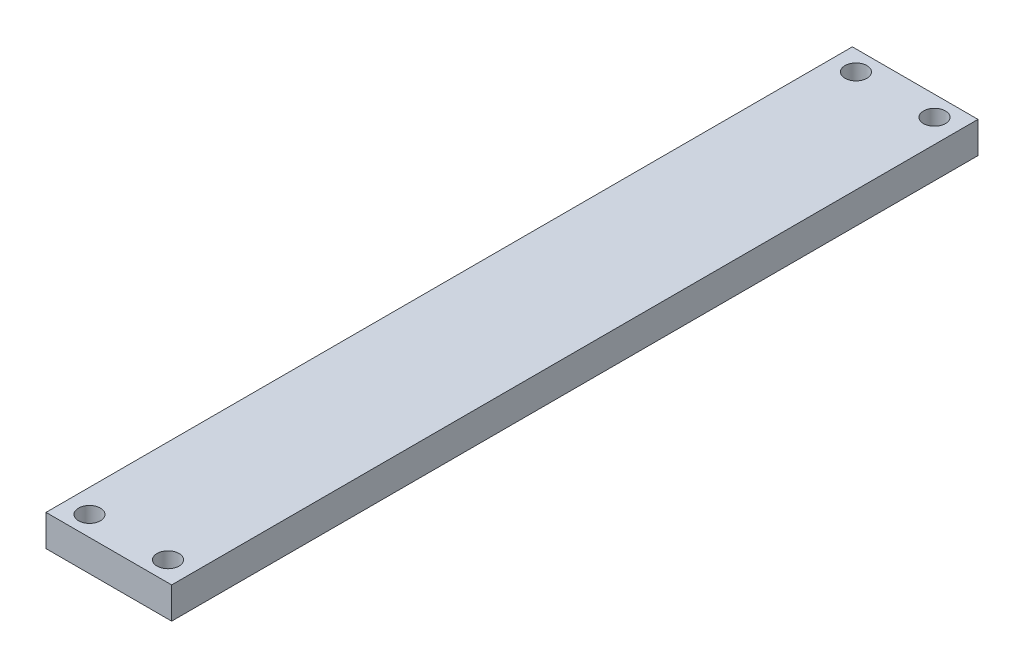
ISO-10303-21;
HEADER;
FILE_DESCRIPTION(('STEP AP214'),'2;1');
FILE_NAME('part.step','',(''),(''),'','','');
FILE_SCHEMA(('AUTOMOTIVE_DESIGN { 1 0 10303 214 1 1 1 1 }'));
ENDSEC;
DATA;
#1=APPLICATION_CONTEXT('core data for automotive mechanical design processes');
#2=APPLICATION_PROTOCOL_DEFINITION('international standard','automotive_design',2000,#1);
#3=PRODUCT_CONTEXT('',#1,'mechanical');
#4=PRODUCT('Part','Part','',(#3));
#5=PRODUCT_RELATED_PRODUCT_CATEGORY('part','',(#4));
#6=PRODUCT_DEFINITION_FORMATION('','',#4);
#7=PRODUCT_DEFINITION_CONTEXT('part definition',#1,'design');
#8=PRODUCT_DEFINITION('design','',#6,#7);
#9=PRODUCT_DEFINITION_SHAPE('','',#8);
#10=(LENGTH_UNIT() NAMED_UNIT(*) SI_UNIT(.MILLI.,.METRE.));
#11=(NAMED_UNIT(*) PLANE_ANGLE_UNIT() SI_UNIT($,.RADIAN.));
#12=(NAMED_UNIT(*) SI_UNIT($,.STERADIAN.) SOLID_ANGLE_UNIT());
#13=UNCERTAINTY_MEASURE_WITH_UNIT(LENGTH_MEASURE(1.E-05),#10,'distance_accuracy_value','');
#14=(GEOMETRIC_REPRESENTATION_CONTEXT(3) GLOBAL_UNCERTAINTY_ASSIGNED_CONTEXT((#13)) GLOBAL_UNIT_ASSIGNED_CONTEXT((#10,
#11,#12)) REPRESENTATION_CONTEXT('',''));
#15=CARTESIAN_POINT('',(0.,0.,0.));
#16=DIRECTION('',(0.,0.,1.));
#17=DIRECTION('',(1.,0.,0.));
#18=AXIS2_PLACEMENT_3D('',#15,#16,#17);
#19=CARTESIAN_POINT('',(10.,-2.5,64.175));
#20=DIRECTION('',(-1.,0.,0.));
#21=DIRECTION('',(0.,0.,1.));
#22=AXIS2_PLACEMENT_3D('',#19,#20,#21);
#23=PLANE('',#22);
#24=DIRECTION('',(0.,1.,0.));
#25=VECTOR('',#24,1.);
#26=CARTESIAN_POINT('',(10.,-2.5,-64.175));
#27=LINE('',#26,#25);
#28=CARTESIAN_POINT('',(10.,-2.5,-64.175));
#29=VERTEX_POINT('',#28);
#30=CARTESIAN_POINT('',(10.,2.5,-64.175));
#31=VERTEX_POINT('',#30);
#32=EDGE_CURVE('E102',#29,#31,#27,.T.);
#33=ORIENTED_EDGE('',*,*,#32,.T.);
#34=DIRECTION('',(0.,0.,-1.));
#35=VECTOR('',#34,1.);
#36=CARTESIAN_POINT('',(10.,2.5,64.175));
#37=LINE('',#36,#35);
#38=CARTESIAN_POINT('',(10.,2.5,64.175));
#39=VERTEX_POINT('',#38);
#40=EDGE_CURVE('E11',#39,#31,#37,.T.);
#41=ORIENTED_EDGE('',*,*,#40,.F.);
#42=DIRECTION('',(0.,1.,0.));
#43=VECTOR('',#42,1.);
#44=CARTESIAN_POINT('',(10.,-2.5,64.175));
#45=LINE('',#44,#43);
#46=CARTESIAN_POINT('',(10.,-2.5,64.175));
#47=VERTEX_POINT('',#46);
#48=EDGE_CURVE('E90',#47,#39,#45,.T.);
#49=ORIENTED_EDGE('',*,*,#48,.F.);
#50=DIRECTION('',(0.,0.,-1.));
#51=VECTOR('',#50,1.);
#52=CARTESIAN_POINT('',(10.,-2.5,64.175));
#53=LINE('',#52,#51);
#54=EDGE_CURVE('E98',#47,#29,#53,.T.);
#55=ORIENTED_EDGE('',*,*,#54,.T.);
#56=EDGE_LOOP('',(#33,#41,#49,#55));
#57=FACE_BOUND('',#56,.T.);
#58=ADVANCED_FACE('F39',(#57),#23,.F.);
#59=CARTESIAN_POINT('',(-10.,2.5,64.175));
#60=DIRECTION('',(0.,-1.,0.));
#61=DIRECTION('',(0.,0.,-1.));
#62=AXIS2_PLACEMENT_3D('',#59,#60,#61);
#63=PLANE('',#62);
#64=CARTESIAN_POINT('',(-6.25,2.5,-61.));
#65=DIRECTION('',(0.,1.,0.));
#66=DIRECTION('',(0.,0.,-1.));
#67=AXIS2_PLACEMENT_3D('',#64,#65,#66);
#68=CIRCLE('',#67,1.75);
#69=CARTESIAN_POINT('',(-6.25,2.5,-62.75));
#70=VERTEX_POINT('',#69);
#71=EDGE_CURVE('E125',#70,#70,#68,.T.);
#72=ORIENTED_EDGE('',*,*,#71,.F.);
#73=EDGE_LOOP('',(#72));
#74=FACE_BOUND('',#73,.T.);
#75=CARTESIAN_POINT('',(6.25,2.5,-61.));
#76=DIRECTION('',(0.,1.,0.));
#77=DIRECTION('',(0.,0.,1.));
#78=AXIS2_PLACEMENT_3D('',#75,#76,#77);
#79=CIRCLE('',#78,1.75);
#80=CARTESIAN_POINT('',(6.25,2.5,-59.25));
#81=VERTEX_POINT('',#80);
#82=EDGE_CURVE('E131',#81,#81,#79,.T.);
#83=ORIENTED_EDGE('',*,*,#82,.F.);
#84=EDGE_LOOP('',(#83));
#85=FACE_BOUND('',#84,.T.);
#86=CARTESIAN_POINT('',(6.25000000000002,2.5,61.));
#87=DIRECTION('',(0.,1.,0.));
#88=DIRECTION('',(0.,0.,-1.));
#89=AXIS2_PLACEMENT_3D('',#86,#87,#88);
#90=CIRCLE('',#89,1.75);
#91=CARTESIAN_POINT('',(6.25000000000002,2.5,59.25));
#92=VERTEX_POINT('',#91);
#93=EDGE_CURVE('E119',#92,#92,#90,.T.);
#94=ORIENTED_EDGE('',*,*,#93,.F.);
#95=EDGE_LOOP('',(#94));
#96=FACE_BOUND('',#95,.T.);
#97=CARTESIAN_POINT('',(-6.24999999999998,2.5,61.));
#98=DIRECTION('',(0.,1.,0.));
#99=DIRECTION('',(0.,0.,1.));
#100=AXIS2_PLACEMENT_3D('',#97,#98,#99);
#101=CIRCLE('',#100,1.75);
#102=CARTESIAN_POINT('',(-6.24999999999998,2.5,62.75));
#103=VERTEX_POINT('',#102);
#104=EDGE_CURVE('E116',#103,#103,#101,.T.);
#105=ORIENTED_EDGE('',*,*,#104,.F.);
#106=EDGE_LOOP('',(#105));
#107=FACE_BOUND('',#106,.T.);
#108=DIRECTION('',(-1.,0.,0.));
#109=VECTOR('',#108,1.);
#110=CARTESIAN_POINT('',(-10.,2.5,-64.175));
#111=LINE('',#110,#109);
#112=CARTESIAN_POINT('',(-10.,2.5,-64.175));
#113=VERTEX_POINT('',#112);
#114=EDGE_CURVE('E94',#31,#113,#111,.T.);
#115=ORIENTED_EDGE('',*,*,#114,.T.);
#116=DIRECTION('',(0.,0.,-1.));
#117=VECTOR('',#116,1.);
#118=CARTESIAN_POINT('',(-10.,2.5,64.175));
#119=LINE('',#118,#117);
#120=CARTESIAN_POINT('',(-10.,2.5,64.175));
#121=VERTEX_POINT('',#120);
#122=EDGE_CURVE('E47',#121,#113,#119,.T.);
#123=ORIENTED_EDGE('',*,*,#122,.F.);
#124=DIRECTION('',(-1.,0.,0.));
#125=VECTOR('',#124,1.);
#126=CARTESIAN_POINT('',(-10.,2.5,64.175));
#127=LINE('',#126,#125);
#128=EDGE_CURVE('E85',#39,#121,#127,.T.);
#129=ORIENTED_EDGE('',*,*,#128,.F.);
#130=ORIENTED_EDGE('',*,*,#40,.T.);
#131=EDGE_LOOP('',(#115,#123,#129,#130));
#132=FACE_BOUND('',#131,.T.);
#133=ADVANCED_FACE('F93',(#74,#85,#96,#107,#132),#63,.F.);
#134=CARTESIAN_POINT('',(-10.,-2.5,64.175));
#135=DIRECTION('',(1.,0.,0.));
#136=DIRECTION('',(0.,0.,-1.));
#137=AXIS2_PLACEMENT_3D('',#134,#135,#136);
#138=PLANE('',#137);
#139=DIRECTION('',(0.,-1.,0.));
#140=VECTOR('',#139,1.);
#141=CARTESIAN_POINT('',(-10.,-2.5,-64.175));
#142=LINE('',#141,#140);
#143=CARTESIAN_POINT('',(-10.,-2.5,-64.175));
#144=VERTEX_POINT('',#143);
#145=EDGE_CURVE('E72',#113,#144,#142,.T.);
#146=ORIENTED_EDGE('',*,*,#145,.T.);
#147=DIRECTION('',(0.,0.,-1.));
#148=VECTOR('',#147,1.);
#149=CARTESIAN_POINT('',(-10.,-2.5,64.175));
#150=LINE('',#149,#148);
#151=CARTESIAN_POINT('',(-10.,-2.5,64.175));
#152=VERTEX_POINT('',#151);
#153=EDGE_CURVE('E95',#152,#144,#150,.T.);
#154=ORIENTED_EDGE('',*,*,#153,.F.);
#155=DIRECTION('',(0.,-1.,0.));
#156=VECTOR('',#155,1.);
#157=CARTESIAN_POINT('',(-10.,-2.5,64.175));
#158=LINE('',#157,#156);
#159=EDGE_CURVE('E88',#121,#152,#158,.T.);
#160=ORIENTED_EDGE('',*,*,#159,.F.);
#161=ORIENTED_EDGE('',*,*,#122,.T.);
#162=EDGE_LOOP('',(#146,#154,#160,#161));
#163=FACE_BOUND('',#162,.T.);
#164=ADVANCED_FACE('F96',(#163),#138,.F.);
#165=CARTESIAN_POINT('',(-10.,-2.5,64.175));
#166=DIRECTION('',(0.,1.,0.));
#167=DIRECTION('',(0.,0.,1.));
#168=AXIS2_PLACEMENT_3D('',#165,#166,#167);
#169=PLANE('',#168);
#170=CARTESIAN_POINT('',(-6.25,-2.5,-61.));
#171=DIRECTION('',(0.,1.,0.));
#172=DIRECTION('',(0.,0.,-1.));
#173=AXIS2_PLACEMENT_3D('',#170,#171,#172);
#174=CIRCLE('',#173,1.75);
#175=CARTESIAN_POINT('',(-6.25,-2.5,-62.75));
#176=VERTEX_POINT('',#175);
#177=EDGE_CURVE('E122',#176,#176,#174,.T.);
#178=ORIENTED_EDGE('',*,*,#177,.T.);
#179=EDGE_LOOP('',(#178));
#180=FACE_BOUND('',#179,.T.);
#181=CARTESIAN_POINT('',(6.25,-2.5,-61.));
#182=DIRECTION('',(0.,1.,0.));
#183=DIRECTION('',(0.,0.,1.));
#184=AXIS2_PLACEMENT_3D('',#181,#182,#183);
#185=CIRCLE('',#184,1.75);
#186=CARTESIAN_POINT('',(6.25,-2.5,-59.25));
#187=VERTEX_POINT('',#186);
#188=EDGE_CURVE('E128',#187,#187,#185,.T.);
#189=ORIENTED_EDGE('',*,*,#188,.T.);
#190=EDGE_LOOP('',(#189));
#191=FACE_BOUND('',#190,.T.);
#192=CARTESIAN_POINT('',(6.25000000000002,-2.5,61.));
#193=DIRECTION('',(0.,1.,0.));
#194=DIRECTION('',(0.,0.,-1.));
#195=AXIS2_PLACEMENT_3D('',#192,#193,#194);
#196=CIRCLE('',#195,1.75);
#197=CARTESIAN_POINT('',(6.25000000000002,-2.5,59.25));
#198=VERTEX_POINT('',#197);
#199=EDGE_CURVE('E134',#198,#198,#196,.T.);
#200=ORIENTED_EDGE('',*,*,#199,.T.);
#201=EDGE_LOOP('',(#200));
#202=FACE_BOUND('',#201,.T.);
#203=CARTESIAN_POINT('',(-6.24999999999998,-2.5,61.));
#204=DIRECTION('',(0.,1.,0.));
#205=DIRECTION('',(0.,0.,1.));
#206=AXIS2_PLACEMENT_3D('',#203,#204,#205);
#207=CIRCLE('',#206,1.75);
#208=CARTESIAN_POINT('',(-6.24999999999998,-2.5,62.75));
#209=VERTEX_POINT('',#208);
#210=EDGE_CURVE('E105',#209,#209,#207,.T.);
#211=ORIENTED_EDGE('',*,*,#210,.T.);
#212=EDGE_LOOP('',(#211));
#213=FACE_BOUND('',#212,.T.);
#214=DIRECTION('',(1.,0.,0.));
#215=VECTOR('',#214,1.);
#216=CARTESIAN_POINT('',(-10.,-2.5,-64.175));
#217=LINE('',#216,#215);
#218=EDGE_CURVE('E78',#144,#29,#217,.T.);
#219=ORIENTED_EDGE('',*,*,#218,.T.);
#220=ORIENTED_EDGE('',*,*,#54,.F.);
#221=DIRECTION('',(1.,0.,0.));
#222=VECTOR('',#221,1.);
#223=CARTESIAN_POINT('',(-10.,-2.5,64.175));
#224=LINE('',#223,#222);
#225=EDGE_CURVE('E55',#152,#47,#224,.T.);
#226=ORIENTED_EDGE('',*,*,#225,.F.);
#227=ORIENTED_EDGE('',*,*,#153,.T.);
#228=EDGE_LOOP('',(#219,#220,#226,#227));
#229=FACE_BOUND('',#228,.T.);
#230=ADVANCED_FACE('F110',(#180,#191,#202,#213,#229),#169,.F.);
#231=CARTESIAN_POINT('',(0.,0.,64.175));
#232=DIRECTION('',(0.,0.,-1.));
#233=DIRECTION('',(-1.,0.,0.));
#234=AXIS2_PLACEMENT_3D('',#231,#232,#233);
#235=PLANE('',#234);
#236=ORIENTED_EDGE('',*,*,#48,.T.);
#237=ORIENTED_EDGE('',*,*,#128,.T.);
#238=ORIENTED_EDGE('',*,*,#159,.T.);
#239=ORIENTED_EDGE('',*,*,#225,.T.);
#240=EDGE_LOOP('',(#236,#237,#238,#239));
#241=FACE_BOUND('',#240,.T.);
#242=ADVANCED_FACE('F86',(#241),#235,.F.);
#243=CARTESIAN_POINT('',(0.,0.,-64.175));
#244=DIRECTION('',(0.,0.,-1.));
#245=DIRECTION('',(-1.,0.,0.));
#246=AXIS2_PLACEMENT_3D('',#243,#244,#245);
#247=PLANE('',#246);
#248=ORIENTED_EDGE('',*,*,#32,.F.);
#249=ORIENTED_EDGE('',*,*,#218,.F.);
#250=ORIENTED_EDGE('',*,*,#145,.F.);
#251=ORIENTED_EDGE('',*,*,#114,.F.);
#252=EDGE_LOOP('',(#248,#249,#250,#251));
#253=FACE_BOUND('',#252,.T.);
#254=ADVANCED_FACE('F113',(#253),#247,.T.);
#255=CARTESIAN_POINT('',(-6.24999999999998,-2.5,61.));
#256=DIRECTION('',(0.,1.,0.));
#257=DIRECTION('',(0.,0.,1.));
#258=AXIS2_PLACEMENT_3D('',#255,#256,#257);
#259=CYLINDRICAL_SURFACE('',#258,1.75);
#260=ORIENTED_EDGE('',*,*,#210,.F.);
#261=EDGE_LOOP('',(#260));
#262=FACE_BOUND('',#261,.T.);
#263=ORIENTED_EDGE('',*,*,#104,.T.);
#264=EDGE_LOOP('',(#263));
#265=FACE_BOUND('',#264,.T.);
#266=ADVANCED_FACE('F147',(#262,#265),#259,.F.);
#267=CARTESIAN_POINT('',(6.25000000000002,-2.5,61.));
#268=DIRECTION('',(0.,1.,0.));
#269=DIRECTION('',(0.,0.,1.));
#270=AXIS2_PLACEMENT_3D('',#267,#268,#269);
#271=CYLINDRICAL_SURFACE('',#270,1.75);
#272=ORIENTED_EDGE('',*,*,#199,.F.);
#273=EDGE_LOOP('',(#272));
#274=FACE_BOUND('',#273,.T.);
#275=ORIENTED_EDGE('',*,*,#93,.T.);
#276=EDGE_LOOP('',(#275));
#277=FACE_BOUND('',#276,.T.);
#278=ADVANCED_FACE('F140',(#274,#277),#271,.F.);
#279=CARTESIAN_POINT('',(6.25,-2.5,-61.));
#280=DIRECTION('',(0.,1.,0.));
#281=DIRECTION('',(0.,0.,1.));
#282=AXIS2_PLACEMENT_3D('',#279,#280,#281);
#283=CYLINDRICAL_SURFACE('',#282,1.75);
#284=ORIENTED_EDGE('',*,*,#188,.F.);
#285=EDGE_LOOP('',(#284));
#286=FACE_BOUND('',#285,.T.);
#287=ORIENTED_EDGE('',*,*,#82,.T.);
#288=EDGE_LOOP('',(#287));
#289=FACE_BOUND('',#288,.T.);
#290=ADVANCED_FACE('F155',(#286,#289),#283,.F.);
#291=CARTESIAN_POINT('',(-6.25,-2.5,-61.));
#292=DIRECTION('',(0.,1.,0.));
#293=DIRECTION('',(0.,0.,1.));
#294=AXIS2_PLACEMENT_3D('',#291,#292,#293);
#295=CYLINDRICAL_SURFACE('',#294,1.75);
#296=ORIENTED_EDGE('',*,*,#177,.F.);
#297=EDGE_LOOP('',(#296));
#298=FACE_BOUND('',#297,.T.);
#299=ORIENTED_EDGE('',*,*,#71,.T.);
#300=EDGE_LOOP('',(#299));
#301=FACE_BOUND('',#300,.T.);
#302=ADVANCED_FACE('F217',(#298,#301),#295,.F.);
#303=CLOSED_SHELL('',(#58,#133,#164,#230,#242,#254,#266,#278,#290,#302));
#304=MANIFOLD_SOLID_BREP('B2',#303);
#305=ADVANCED_BREP_SHAPE_REPRESENTATION('',(#18,#304),#14);
#306=SHAPE_DEFINITION_REPRESENTATION(#9,#305);
ENDSEC;
END-ISO-10303-21;
